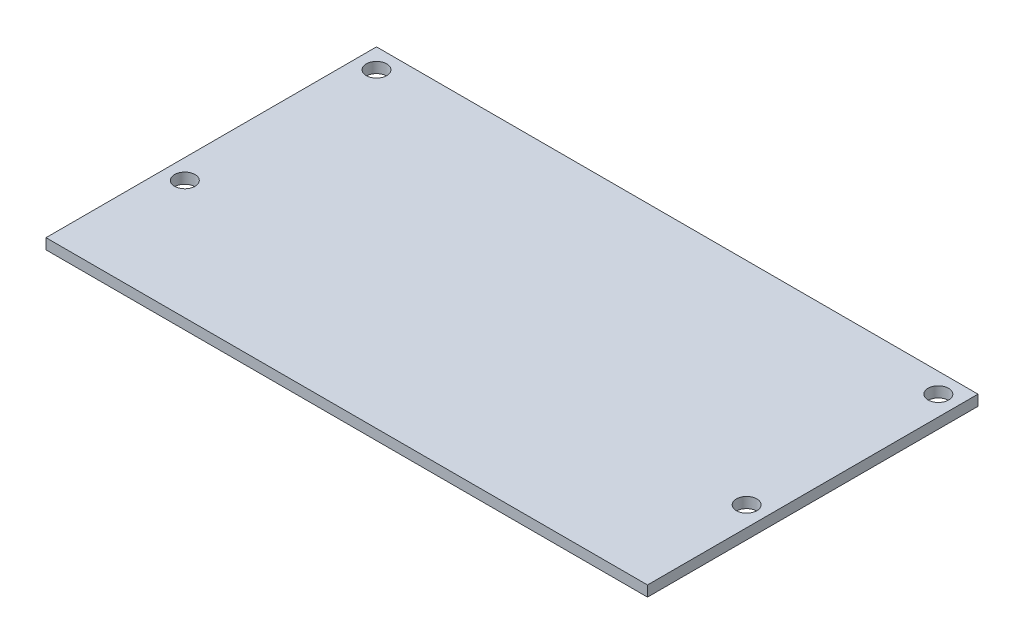
ISO-10303-21;
HEADER;
FILE_DESCRIPTION(('STEP AP214'),'2;1');
FILE_NAME('part.step','',(''),(''),'','','');
FILE_SCHEMA(('AUTOMOTIVE_DESIGN { 1 0 10303 214 1 1 1 1 }'));
ENDSEC;
DATA;
#1=APPLICATION_CONTEXT('core data for automotive mechanical design processes');
#2=APPLICATION_PROTOCOL_DEFINITION('international standard','automotive_design',2000,#1);
#3=PRODUCT_CONTEXT('',#1,'mechanical');
#4=PRODUCT('Part','Part','',(#3));
#5=PRODUCT_RELATED_PRODUCT_CATEGORY('part','',(#4));
#6=PRODUCT_DEFINITION_FORMATION('','',#4);
#7=PRODUCT_DEFINITION_CONTEXT('part definition',#1,'design');
#8=PRODUCT_DEFINITION('design','',#6,#7);
#9=PRODUCT_DEFINITION_SHAPE('','',#8);
#10=(LENGTH_UNIT() NAMED_UNIT(*) SI_UNIT(.MILLI.,.METRE.));
#11=(NAMED_UNIT(*) PLANE_ANGLE_UNIT() SI_UNIT($,.RADIAN.));
#12=(NAMED_UNIT(*) SI_UNIT($,.STERADIAN.) SOLID_ANGLE_UNIT());
#13=UNCERTAINTY_MEASURE_WITH_UNIT(LENGTH_MEASURE(1.E-05),#10,'distance_accuracy_value','');
#14=(GEOMETRIC_REPRESENTATION_CONTEXT(3) GLOBAL_UNCERTAINTY_ASSIGNED_CONTEXT((#13)) GLOBAL_UNIT_ASSIGNED_CONTEXT((#10,
#11,#12)) REPRESENTATION_CONTEXT('',''));
#15=CARTESIAN_POINT('',(0.,0.,0.));
#16=DIRECTION('',(0.,0.,1.));
#17=DIRECTION('',(1.,0.,0.));
#18=AXIS2_PLACEMENT_3D('',#15,#16,#17);
#19=CARTESIAN_POINT('',(0.,1.6,0.));
#20=DIRECTION('',(0.,1.,0.));
#21=DIRECTION('',(0.,0.,1.));
#22=AXIS2_PLACEMENT_3D('',#19,#20,#21);
#23=PLANE('',#22);
#24=CARTESIAN_POINT('',(42.5,1.6,-22.));
#25=DIRECTION('',(0.,1.,0.));
#26=DIRECTION('',(0.,0.,1.));
#27=AXIS2_PLACEMENT_3D('',#24,#25,#26);
#28=CIRCLE('',#27,1.55);
#29=CARTESIAN_POINT('',(42.5,1.6,-20.45));
#30=VERTEX_POINT('',#29);
#31=EDGE_CURVE('E142',#30,#30,#28,.T.);
#32=ORIENTED_EDGE('',*,*,#31,.F.);
#33=EDGE_LOOP('',(#32));
#34=FACE_BOUND('',#33,.T.);
#35=CARTESIAN_POINT('',(-42.5,1.6,-22.));
#36=DIRECTION('',(0.,1.,0.));
#37=DIRECTION('',(0.,0.,1.));
#38=AXIS2_PLACEMENT_3D('',#35,#36,#37);
#39=CIRCLE('',#38,1.55);
#40=CARTESIAN_POINT('',(-42.5,1.6,-20.45));
#41=VERTEX_POINT('',#40);
#42=EDGE_CURVE('E112',#41,#41,#39,.T.);
#43=ORIENTED_EDGE('',*,*,#42,.F.);
#44=EDGE_LOOP('',(#43));
#45=FACE_BOUND('',#44,.T.);
#46=DIRECTION('',(0.,0.,-1.));
#47=VECTOR('',#46,1.);
#48=CARTESIAN_POINT('',(45.5,1.6,-25.));
#49=LINE('',#48,#47);
#50=CARTESIAN_POINT('',(45.5,1.6,25.));
#51=VERTEX_POINT('',#50);
#52=CARTESIAN_POINT('',(45.5,1.6,-25.));
#53=VERTEX_POINT('',#52);
#54=EDGE_CURVE('E92',#51,#53,#49,.T.);
#55=ORIENTED_EDGE('',*,*,#54,.T.);
#56=DIRECTION('',(-1.,0.,0.));
#57=VECTOR('',#56,1.);
#58=CARTESIAN_POINT('',(-45.5,1.6,-25.));
#59=LINE('',#58,#57);
#60=CARTESIAN_POINT('',(-45.5,1.6,-25.));
#61=VERTEX_POINT('',#60);
#62=EDGE_CURVE('E87',#53,#61,#59,.T.);
#63=ORIENTED_EDGE('',*,*,#62,.T.);
#64=DIRECTION('',(0.,0.,1.));
#65=VECTOR('',#64,1.);
#66=CARTESIAN_POINT('',(-45.5,1.6,-25.));
#67=LINE('',#66,#65);
#68=CARTESIAN_POINT('',(-45.5,1.6,25.));
#69=VERTEX_POINT('',#68);
#70=EDGE_CURVE('E90',#61,#69,#67,.T.);
#71=ORIENTED_EDGE('',*,*,#70,.T.);
#72=DIRECTION('',(1.,0.,0.));
#73=VECTOR('',#72,1.);
#74=CARTESIAN_POINT('',(-45.5,1.6,25.));
#75=LINE('',#74,#73);
#76=EDGE_CURVE('E57',#69,#51,#75,.T.);
#77=ORIENTED_EDGE('',*,*,#76,.T.);
#78=EDGE_LOOP('',(#55,#63,#71,#77));
#79=FACE_BOUND('',#78,.T.);
#80=CARTESIAN_POINT('',(-42.5,1.6,7.));
#81=DIRECTION('',(0.,1.,0.));
#82=DIRECTION('',(0.,0.,1.));
#83=AXIS2_PLACEMENT_3D('',#80,#81,#82);
#84=CIRCLE('',#83,1.55);
#85=CARTESIAN_POINT('',(-42.5,1.6,8.55));
#86=VERTEX_POINT('',#85);
#87=EDGE_CURVE('E134',#86,#86,#84,.T.);
#88=ORIENTED_EDGE('',*,*,#87,.F.);
#89=EDGE_LOOP('',(#88));
#90=FACE_BOUND('',#89,.T.);
#91=CARTESIAN_POINT('',(42.5,1.6,7.));
#92=DIRECTION('',(0.,1.,0.));
#93=DIRECTION('',(0.,0.,1.));
#94=AXIS2_PLACEMENT_3D('',#91,#92,#93);
#95=CIRCLE('',#94,1.55);
#96=CARTESIAN_POINT('',(42.5,1.6,8.55));
#97=VERTEX_POINT('',#96);
#98=EDGE_CURVE('E150',#97,#97,#95,.T.);
#99=ORIENTED_EDGE('',*,*,#98,.F.);
#100=EDGE_LOOP('',(#99));
#101=FACE_BOUND('',#100,.T.);
#102=ADVANCED_FACE('F39',(#34,#45,#79,#90,#101),#23,.T.);
#103=CARTESIAN_POINT('',(0.,0.,0.));
#104=DIRECTION('',(0.,1.,0.));
#105=DIRECTION('',(0.,0.,1.));
#106=AXIS2_PLACEMENT_3D('',#103,#104,#105);
#107=PLANE('',#106);
#108=DIRECTION('',(0.,0.,-1.));
#109=VECTOR('',#108,1.);
#110=CARTESIAN_POINT('',(45.5,0.,-25.));
#111=LINE('',#110,#109);
#112=CARTESIAN_POINT('',(45.5,0.,25.));
#113=VERTEX_POINT('',#112);
#114=CARTESIAN_POINT('',(45.5,0.,-25.));
#115=VERTEX_POINT('',#114);
#116=EDGE_CURVE('E108',#113,#115,#111,.T.);
#117=ORIENTED_EDGE('',*,*,#116,.F.);
#118=DIRECTION('',(1.,0.,0.));
#119=VECTOR('',#118,1.);
#120=CARTESIAN_POINT('',(-45.5,0.,25.));
#121=LINE('',#120,#119);
#122=CARTESIAN_POINT('',(-45.5,0.,25.));
#123=VERTEX_POINT('',#122);
#124=EDGE_CURVE('E80',#123,#113,#121,.T.);
#125=ORIENTED_EDGE('',*,*,#124,.F.);
#126=DIRECTION('',(0.,0.,1.));
#127=VECTOR('',#126,1.);
#128=CARTESIAN_POINT('',(-45.5,0.,-25.));
#129=LINE('',#128,#127);
#130=CARTESIAN_POINT('',(-45.5,0.,-25.));
#131=VERTEX_POINT('',#130);
#132=EDGE_CURVE('E74',#131,#123,#129,.T.);
#133=ORIENTED_EDGE('',*,*,#132,.F.);
#134=DIRECTION('',(-1.,0.,0.));
#135=VECTOR('',#134,1.);
#136=CARTESIAN_POINT('',(-45.5,0.,-25.));
#137=LINE('',#136,#135);
#138=EDGE_CURVE('E97',#115,#131,#137,.T.);
#139=ORIENTED_EDGE('',*,*,#138,.F.);
#140=EDGE_LOOP('',(#117,#125,#133,#139));
#141=FACE_BOUND('',#140,.T.);
#142=CARTESIAN_POINT('',(-42.5,0.,-22.));
#143=DIRECTION('',(0.,1.,0.));
#144=DIRECTION('',(0.,0.,1.));
#145=AXIS2_PLACEMENT_3D('',#142,#143,#144);
#146=CIRCLE('',#145,1.55);
#147=CARTESIAN_POINT('',(-42.5,0.,-20.45));
#148=VERTEX_POINT('',#147);
#149=EDGE_CURVE('E130',#148,#148,#146,.T.);
#150=ORIENTED_EDGE('',*,*,#149,.T.);
#151=EDGE_LOOP('',(#150));
#152=FACE_BOUND('',#151,.T.);
#153=CARTESIAN_POINT('',(-42.5,0.,7.));
#154=DIRECTION('',(0.,1.,0.));
#155=DIRECTION('',(0.,0.,1.));
#156=AXIS2_PLACEMENT_3D('',#153,#154,#155);
#157=CIRCLE('',#156,1.55);
#158=CARTESIAN_POINT('',(-42.5,0.,8.55));
#159=VERTEX_POINT('',#158);
#160=EDGE_CURVE('E138',#159,#159,#157,.T.);
#161=ORIENTED_EDGE('',*,*,#160,.T.);
#162=EDGE_LOOP('',(#161));
#163=FACE_BOUND('',#162,.T.);
#164=CARTESIAN_POINT('',(42.5,0.,-22.));
#165=DIRECTION('',(0.,1.,0.));
#166=DIRECTION('',(0.,0.,1.));
#167=AXIS2_PLACEMENT_3D('',#164,#165,#166);
#168=CIRCLE('',#167,1.55);
#169=CARTESIAN_POINT('',(42.5,0.,-20.45));
#170=VERTEX_POINT('',#169);
#171=EDGE_CURVE('E146',#170,#170,#168,.T.);
#172=ORIENTED_EDGE('',*,*,#171,.T.);
#173=EDGE_LOOP('',(#172));
#174=FACE_BOUND('',#173,.T.);
#175=CARTESIAN_POINT('',(42.5,0.,7.));
#176=DIRECTION('',(0.,1.,0.));
#177=DIRECTION('',(0.,0.,1.));
#178=AXIS2_PLACEMENT_3D('',#175,#176,#177);
#179=CIRCLE('',#178,1.55);
#180=CARTESIAN_POINT('',(42.5,0.,8.55));
#181=VERTEX_POINT('',#180);
#182=EDGE_CURVE('E154',#181,#181,#179,.T.);
#183=ORIENTED_EDGE('',*,*,#182,.T.);
#184=EDGE_LOOP('',(#183));
#185=FACE_BOUND('',#184,.T.);
#186=ADVANCED_FACE('F125',(#141,#152,#163,#174,#185),#107,.F.);
#187=CARTESIAN_POINT('',(45.5,1.6,-25.));
#188=DIRECTION('',(-1.,0.,0.));
#189=DIRECTION('',(0.,0.,1.));
#190=AXIS2_PLACEMENT_3D('',#187,#188,#189);
#191=PLANE('',#190);
#192=ORIENTED_EDGE('',*,*,#116,.T.);
#193=DIRECTION('',(0.,-1.,0.));
#194=VECTOR('',#193,1.);
#195=CARTESIAN_POINT('',(45.5,1.6,-25.));
#196=LINE('',#195,#194);
#197=EDGE_CURVE('E11',#53,#115,#196,.T.);
#198=ORIENTED_EDGE('',*,*,#197,.F.);
#199=ORIENTED_EDGE('',*,*,#54,.F.);
#200=DIRECTION('',(0.,-1.,0.));
#201=VECTOR('',#200,1.);
#202=CARTESIAN_POINT('',(45.5,1.6,25.));
#203=LINE('',#202,#201);
#204=EDGE_CURVE('E104',#51,#113,#203,.T.);
#205=ORIENTED_EDGE('',*,*,#204,.T.);
#206=EDGE_LOOP('',(#192,#198,#199,#205));
#207=FACE_BOUND('',#206,.T.);
#208=ADVANCED_FACE('F41',(#207),#191,.F.);
#209=CARTESIAN_POINT('',(-45.5,1.6,-25.));
#210=DIRECTION('',(0.,0.,1.));
#211=DIRECTION('',(1.,0.,0.));
#212=AXIS2_PLACEMENT_3D('',#209,#210,#211);
#213=PLANE('',#212);
#214=ORIENTED_EDGE('',*,*,#138,.T.);
#215=DIRECTION('',(0.,-1.,0.));
#216=VECTOR('',#215,1.);
#217=CARTESIAN_POINT('',(-45.5,1.6,-25.));
#218=LINE('',#217,#216);
#219=EDGE_CURVE('E49',#61,#131,#218,.T.);
#220=ORIENTED_EDGE('',*,*,#219,.F.);
#221=ORIENTED_EDGE('',*,*,#62,.F.);
#222=ORIENTED_EDGE('',*,*,#197,.T.);
#223=EDGE_LOOP('',(#214,#220,#221,#222));
#224=FACE_BOUND('',#223,.T.);
#225=ADVANCED_FACE('F96',(#224),#213,.F.);
#226=CARTESIAN_POINT('',(-45.5,1.6,-25.));
#227=DIRECTION('',(1.,0.,0.));
#228=DIRECTION('',(0.,0.,-1.));
#229=AXIS2_PLACEMENT_3D('',#226,#227,#228);
#230=PLANE('',#229);
#231=ORIENTED_EDGE('',*,*,#132,.T.);
#232=DIRECTION('',(0.,-1.,0.));
#233=VECTOR('',#232,1.);
#234=CARTESIAN_POINT('',(-45.5,1.6,25.));
#235=LINE('',#234,#233);
#236=EDGE_CURVE('E99',#69,#123,#235,.T.);
#237=ORIENTED_EDGE('',*,*,#236,.F.);
#238=ORIENTED_EDGE('',*,*,#70,.F.);
#239=ORIENTED_EDGE('',*,*,#219,.T.);
#240=EDGE_LOOP('',(#231,#237,#238,#239));
#241=FACE_BOUND('',#240,.T.);
#242=ADVANCED_FACE('F100',(#241),#230,.F.);
#243=CARTESIAN_POINT('',(-45.5,1.6,25.));
#244=DIRECTION('',(0.,0.,-1.));
#245=DIRECTION('',(-1.,0.,0.));
#246=AXIS2_PLACEMENT_3D('',#243,#244,#245);
#247=PLANE('',#246);
#248=ORIENTED_EDGE('',*,*,#124,.T.);
#249=ORIENTED_EDGE('',*,*,#204,.F.);
#250=ORIENTED_EDGE('',*,*,#76,.F.);
#251=ORIENTED_EDGE('',*,*,#236,.T.);
#252=EDGE_LOOP('',(#248,#249,#250,#251));
#253=FACE_BOUND('',#252,.T.);
#254=ADVANCED_FACE('F122',(#253),#247,.F.);
#255=CARTESIAN_POINT('',(-42.5,1.6,-22.));
#256=DIRECTION('',(0.,-1.,0.));
#257=DIRECTION('',(0.,0.,-1.));
#258=AXIS2_PLACEMENT_3D('',#255,#256,#257);
#259=CYLINDRICAL_SURFACE('',#258,1.55);
#260=ORIENTED_EDGE('',*,*,#42,.T.);
#261=EDGE_LOOP('',(#260));
#262=FACE_BOUND('',#261,.T.);
#263=ORIENTED_EDGE('',*,*,#149,.F.);
#264=EDGE_LOOP('',(#263));
#265=FACE_BOUND('',#264,.T.);
#266=ADVANCED_FACE('F175',(#262,#265),#259,.F.);
#267=CARTESIAN_POINT('',(-42.5,1.6,7.));
#268=DIRECTION('',(0.,-1.,0.));
#269=DIRECTION('',(0.,0.,-1.));
#270=AXIS2_PLACEMENT_3D('',#267,#268,#269);
#271=CYLINDRICAL_SURFACE('',#270,1.55);
#272=ORIENTED_EDGE('',*,*,#87,.T.);
#273=EDGE_LOOP('',(#272));
#274=FACE_BOUND('',#273,.T.);
#275=ORIENTED_EDGE('',*,*,#160,.F.);
#276=EDGE_LOOP('',(#275));
#277=FACE_BOUND('',#276,.T.);
#278=ADVANCED_FACE('F221',(#274,#277),#271,.F.);
#279=CARTESIAN_POINT('',(42.5,1.6,-22.));
#280=DIRECTION('',(0.,-1.,0.));
#281=DIRECTION('',(0.,0.,-1.));
#282=AXIS2_PLACEMENT_3D('',#279,#280,#281);
#283=CYLINDRICAL_SURFACE('',#282,1.55);
#284=ORIENTED_EDGE('',*,*,#31,.T.);
#285=EDGE_LOOP('',(#284));
#286=FACE_BOUND('',#285,.T.);
#287=ORIENTED_EDGE('',*,*,#171,.F.);
#288=EDGE_LOOP('',(#287));
#289=FACE_BOUND('',#288,.T.);
#290=ADVANCED_FACE('F229',(#286,#289),#283,.F.);
#291=CARTESIAN_POINT('',(42.5,1.6,7.));
#292=DIRECTION('',(0.,-1.,0.));
#293=DIRECTION('',(0.,0.,-1.));
#294=AXIS2_PLACEMENT_3D('',#291,#292,#293);
#295=CYLINDRICAL_SURFACE('',#294,1.55);
#296=ORIENTED_EDGE('',*,*,#98,.T.);
#297=EDGE_LOOP('',(#296));
#298=FACE_BOUND('',#297,.T.);
#299=ORIENTED_EDGE('',*,*,#182,.F.);
#300=EDGE_LOOP('',(#299));
#301=FACE_BOUND('',#300,.T.);
#302=ADVANCED_FACE('F162',(#298,#301),#295,.F.);
#303=CLOSED_SHELL('',(#102,#186,#208,#225,#242,#254,#266,#278,#290,#302));
#304=MANIFOLD_SOLID_BREP('B2',#303);
#305=ADVANCED_BREP_SHAPE_REPRESENTATION('',(#18,#304),#14);
#306=SHAPE_DEFINITION_REPRESENTATION(#9,#305);
ENDSEC;
END-ISO-10303-21;
